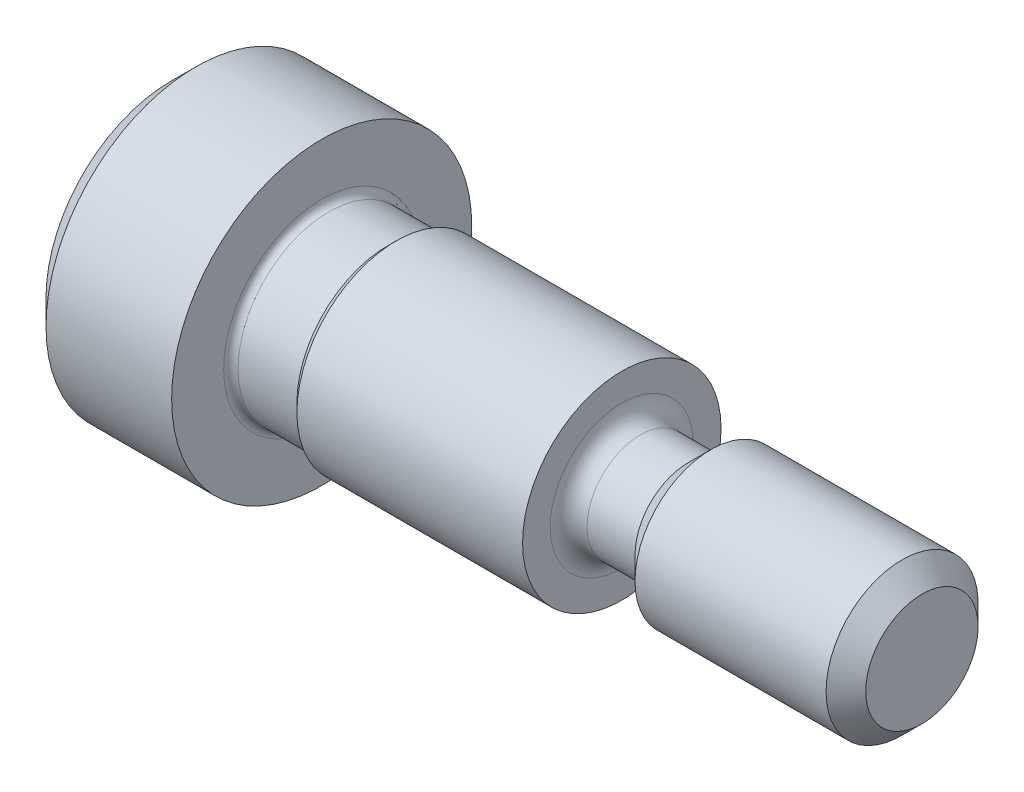
ISO-10303-21;
HEADER;
FILE_DESCRIPTION(('STEP AP214'),'2;1');
FILE_NAME('part.step','',(''),(''),'','','');
FILE_SCHEMA(('AUTOMOTIVE_DESIGN { 1 0 10303 214 1 1 1 1 }'));
ENDSEC;
DATA;
#1=APPLICATION_CONTEXT('core data for automotive mechanical design processes');
#2=APPLICATION_PROTOCOL_DEFINITION('international standard','automotive_design',2000,#1);
#3=PRODUCT_CONTEXT('',#1,'mechanical');
#4=PRODUCT('Part','Part','',(#3));
#5=PRODUCT_RELATED_PRODUCT_CATEGORY('part','',(#4));
#6=PRODUCT_DEFINITION_FORMATION('','',#4);
#7=PRODUCT_DEFINITION_CONTEXT('part definition',#1,'design');
#8=PRODUCT_DEFINITION('design','',#6,#7);
#9=PRODUCT_DEFINITION_SHAPE('','',#8);
#10=(LENGTH_UNIT() NAMED_UNIT(*) SI_UNIT(.MILLI.,.METRE.));
#11=(NAMED_UNIT(*) PLANE_ANGLE_UNIT() SI_UNIT($,.RADIAN.));
#12=(NAMED_UNIT(*) SI_UNIT($,.STERADIAN.) SOLID_ANGLE_UNIT());
#13=UNCERTAINTY_MEASURE_WITH_UNIT(LENGTH_MEASURE(1.E-05),#10,'distance_accuracy_value','');
#14=(GEOMETRIC_REPRESENTATION_CONTEXT(3) GLOBAL_UNCERTAINTY_ASSIGNED_CONTEXT((#13)) GLOBAL_UNIT_ASSIGNED_CONTEXT((#10,
#11,#12)) REPRESENTATION_CONTEXT('',''));
#15=CARTESIAN_POINT('',(0.,0.,0.));
#16=DIRECTION('',(0.,0.,1.));
#17=DIRECTION('',(1.,0.,0.));
#18=AXIS2_PLACEMENT_3D('',#15,#16,#17);
#19=CARTESIAN_POINT('',(0.,0.,0.));
#20=DIRECTION('',(-1.,0.,0.));
#21=DIRECTION('',(0.,0.,1.));
#22=AXIS2_PLACEMENT_3D('',#19,#20,#21);
#23=PLANE('',#22);
#24=CARTESIAN_POINT('',(0.,0.,0.));
#25=DIRECTION('',(-1.,0.,0.));
#26=DIRECTION('',(0.,0.,1.));
#27=AXIS2_PLACEMENT_3D('',#24,#25,#26);
#28=CIRCLE('',#27,3.9751);
#29=CARTESIAN_POINT('',(0.,0.,3.9751));
#30=VERTEX_POINT('',#29);
#31=EDGE_CURVE('E11',#30,#30,#28,.T.);
#32=ORIENTED_EDGE('',*,*,#31,.T.);
#33=EDGE_LOOP('',(#32));
#34=FACE_BOUND('',#33,.T.);
#35=DIRECTION('',(0.,-0.500000000000001,-0.866025403784438));
#36=VECTOR('',#35,1.);
#37=CARTESIAN_POINT('',(0.,-0.916543552338529,1.5875));
#38=LINE('',#37,#36);
#39=CARTESIAN_POINT('',(0.,-0.916543552338529,1.5875));
#40=VERTEX_POINT('',#39);
#41=CARTESIAN_POINT('',(0.,-1.83308710467706,0.));
#42=VERTEX_POINT('',#41);
#43=EDGE_CURVE('E51',#40,#42,#38,.T.);
#44=ORIENTED_EDGE('',*,*,#43,.T.);
#45=DIRECTION('',(0.,0.500000000000001,-0.866025403784438));
#46=VECTOR('',#45,1.);
#47=CARTESIAN_POINT('',(0.,-1.83308710467706,0.));
#48=LINE('',#47,#46);
#49=CARTESIAN_POINT('',(0.,-0.916543552338529,-1.5875));
#50=VERTEX_POINT('',#49);
#51=EDGE_CURVE('E528',#42,#50,#48,.T.);
#52=ORIENTED_EDGE('',*,*,#51,.T.);
#53=DIRECTION('',(0.,1.,0.));
#54=VECTOR('',#53,1.);
#55=CARTESIAN_POINT('',(0.,-0.916543552338529,-1.5875));
#56=LINE('',#55,#54);
#57=CARTESIAN_POINT('',(0.,0.916543552338529,-1.5875));
#58=VERTEX_POINT('',#57);
#59=EDGE_CURVE('E131',#50,#58,#56,.T.);
#60=ORIENTED_EDGE('',*,*,#59,.T.);
#61=DIRECTION('',(0.,0.500000000000001,0.866025403784438));
#62=VECTOR('',#61,1.);
#63=CARTESIAN_POINT('',(0.,0.916543552338529,-1.5875));
#64=LINE('',#63,#62);
#65=CARTESIAN_POINT('',(0.,1.83308710467706,0.));
#66=VERTEX_POINT('',#65);
#67=EDGE_CURVE('E531',#58,#66,#64,.T.);
#68=ORIENTED_EDGE('',*,*,#67,.T.);
#69=DIRECTION('',(0.,-0.500000000000001,0.866025403784438));
#70=VECTOR('',#69,1.);
#71=CARTESIAN_POINT('',(0.,1.83308710467706,0.));
#72=LINE('',#71,#70);
#73=CARTESIAN_POINT('',(0.,0.916543552338529,1.5875));
#74=VERTEX_POINT('',#73);
#75=EDGE_CURVE('E533',#66,#74,#72,.T.);
#76=ORIENTED_EDGE('',*,*,#75,.T.);
#77=DIRECTION('',(0.,-1.,0.));
#78=VECTOR('',#77,1.);
#79=CARTESIAN_POINT('',(0.,0.916543552338529,1.5875));
#80=LINE('',#79,#78);
#81=EDGE_CURVE('E535',#74,#40,#80,.T.);
#82=ORIENTED_EDGE('',*,*,#81,.T.);
#83=EDGE_LOOP('',(#44,#52,#60,#68,#76,#82));
#84=FACE_BOUND('',#83,.T.);
#85=ADVANCED_FACE('F36',(#34,#84),#23,.T.);
#86=CARTESIAN_POINT('',(0.,0.,0.));
#87=DIRECTION('',(1.,0.,0.));
#88=DIRECTION('',(0.,0.,-1.));
#89=AXIS2_PLACEMENT_3D('',#86,#87,#88);
#90=CONICAL_SURFACE('',#89,3.9751,0.785398163397449);
#91=CARTESIAN_POINT('',(0.787400000000001,0.,0.));
#92=DIRECTION('',(-1.,0.,0.));
#93=DIRECTION('',(0.,0.,1.));
#94=AXIS2_PLACEMENT_3D('',#91,#92,#93);
#95=CIRCLE('',#94,4.7625);
#96=CARTESIAN_POINT('',(0.787400000000001,0.,4.7625));
#97=VERTEX_POINT('',#96);
#98=EDGE_CURVE('E44',#97,#97,#95,.T.);
#99=ORIENTED_EDGE('',*,*,#98,.T.);
#100=EDGE_LOOP('',(#99));
#101=FACE_BOUND('',#100,.T.);
#102=ORIENTED_EDGE('',*,*,#31,.F.);
#103=EDGE_LOOP('',(#102));
#104=FACE_BOUND('',#103,.T.);
#105=ADVANCED_FACE('F197',(#101,#104),#90,.T.);
#106=CARTESIAN_POINT('',(-6.34999999999999,0.,0.));
#107=DIRECTION('',(-1.,0.,0.));
#108=DIRECTION('',(0.,0.,1.));
#109=AXIS2_PLACEMENT_3D('',#106,#107,#108);
#110=CYLINDRICAL_SURFACE('',#109,4.7625);
#111=CARTESIAN_POINT('',(4.7752,0.,0.));
#112=DIRECTION('',(-1.,0.,0.));
#113=DIRECTION('',(0.,0.,1.));
#114=AXIS2_PLACEMENT_3D('',#111,#112,#113);
#115=CIRCLE('',#114,4.7625);
#116=CARTESIAN_POINT('',(4.7752,0.,4.7625));
#117=VERTEX_POINT('',#116);
#118=EDGE_CURVE('E189',#117,#117,#115,.T.);
#119=ORIENTED_EDGE('',*,*,#118,.T.);
#120=EDGE_LOOP('',(#119));
#121=FACE_BOUND('',#120,.T.);
#122=ORIENTED_EDGE('',*,*,#98,.F.);
#123=EDGE_LOOP('',(#122));
#124=FACE_BOUND('',#123,.T.);
#125=ADVANCED_FACE('F200',(#121,#124),#110,.T.);
#126=CARTESIAN_POINT('',(4.7752,4.7625,0.));
#127=DIRECTION('',(1.,0.,0.));
#128=DIRECTION('',(0.,0.,-1.));
#129=AXIS2_PLACEMENT_3D('',#126,#127,#128);
#130=PLANE('',#129);
#131=CARTESIAN_POINT('',(4.7752,0.,0.));
#132=DIRECTION('',(-1.,0.,0.));
#133=DIRECTION('',(0.,0.,1.));
#134=AXIS2_PLACEMENT_3D('',#131,#132,#133);
#135=CIRCLE('',#134,3.1115);
#136=CARTESIAN_POINT('',(4.7752,0.,3.1115));
#137=VERTEX_POINT('',#136);
#138=EDGE_CURVE('E185',#137,#137,#135,.T.);
#139=ORIENTED_EDGE('',*,*,#138,.T.);
#140=EDGE_LOOP('',(#139));
#141=FACE_BOUND('',#140,.T.);
#142=ORIENTED_EDGE('',*,*,#118,.F.);
#143=EDGE_LOOP('',(#142));
#144=FACE_BOUND('',#143,.T.);
#145=ADVANCED_FACE('F202',(#141,#144),#130,.T.);
#146=CARTESIAN_POINT('',(5.0038,0.,0.));
#147=DIRECTION('',(-1.,0.,0.));
#148=DIRECTION('',(0.,0.,1.));
#149=AXIS2_PLACEMENT_3D('',#146,#147,#148);
#150=TOROIDAL_SURFACE('',#149,3.1115,0.2286);
#151=ORIENTED_EDGE('',*,*,#138,.F.);
#152=EDGE_LOOP('',(#151));
#153=FACE_BOUND('',#152,.T.);
#154=CARTESIAN_POINT('',(5.0038,0.,0.));
#155=DIRECTION('',(-1.,0.,0.));
#156=DIRECTION('',(0.,0.,1.));
#157=AXIS2_PLACEMENT_3D('',#154,#155,#156);
#158=CIRCLE('',#157,2.8829);
#159=CARTESIAN_POINT('',(5.0038,0.,2.8829));
#160=VERTEX_POINT('',#159);
#161=EDGE_CURVE('E181',#160,#160,#158,.T.);
#162=ORIENTED_EDGE('',*,*,#161,.T.);
#163=EDGE_LOOP('',(#162));
#164=FACE_BOUND('',#163,.T.);
#165=ADVANCED_FACE('F209',(#153,#164),#150,.F.);
#166=CARTESIAN_POINT('',(-6.34999999999999,0.,0.));
#167=DIRECTION('',(-1.,0.,0.));
#168=DIRECTION('',(0.,0.,1.));
#169=AXIS2_PLACEMENT_3D('',#166,#167,#168);
#170=CYLINDRICAL_SURFACE('',#169,2.8829);
#171=CARTESIAN_POINT('',(6.8707,0.,0.));
#172=DIRECTION('',(-1.,0.,0.));
#173=DIRECTION('',(0.,0.,1.));
#174=AXIS2_PLACEMENT_3D('',#171,#172,#173);
#175=CIRCLE('',#174,2.8829);
#176=CARTESIAN_POINT('',(6.8707,0.,2.8829));
#177=VERTEX_POINT('',#176);
#178=EDGE_CURVE('E177',#177,#177,#175,.T.);
#179=ORIENTED_EDGE('',*,*,#178,.T.);
#180=EDGE_LOOP('',(#179));
#181=FACE_BOUND('',#180,.T.);
#182=ORIENTED_EDGE('',*,*,#161,.F.);
#183=EDGE_LOOP('',(#182));
#184=FACE_BOUND('',#183,.T.);
#185=ADVANCED_FACE('F227',(#181,#184),#170,.T.);
#186=CARTESIAN_POINT('',(6.8707,0.,0.));
#187=DIRECTION('',(1.,0.,0.));
#188=DIRECTION('',(0.,0.,-1.));
#189=AXIS2_PLACEMENT_3D('',#186,#187,#188);
#190=CONICAL_SURFACE('',#189,2.8829,0.785398163397452);
#191=CARTESIAN_POINT('',(7.1374,0.,0.));
#192=DIRECTION('',(-1.,0.,0.));
#193=DIRECTION('',(0.,0.,1.));
#194=AXIS2_PLACEMENT_3D('',#191,#192,#193);
#195=CIRCLE('',#194,3.1496);
#196=CARTESIAN_POINT('',(7.1374,0.,3.1496));
#197=VERTEX_POINT('',#196);
#198=EDGE_CURVE('E173',#197,#197,#195,.T.);
#199=ORIENTED_EDGE('',*,*,#198,.T.);
#200=EDGE_LOOP('',(#199));
#201=FACE_BOUND('',#200,.T.);
#202=ORIENTED_EDGE('',*,*,#178,.F.);
#203=EDGE_LOOP('',(#202));
#204=FACE_BOUND('',#203,.T.);
#205=ADVANCED_FACE('F231',(#201,#204),#190,.T.);
#206=CARTESIAN_POINT('',(-6.34999999999999,0.,0.));
#207=DIRECTION('',(-1.,0.,0.));
#208=DIRECTION('',(0.,0.,1.));
#209=AXIS2_PLACEMENT_3D('',#206,#207,#208);
#210=CYLINDRICAL_SURFACE('',#209,3.1496);
#211=CARTESIAN_POINT('',(14.3002,0.,0.));
#212=DIRECTION('',(-1.,0.,0.));
#213=DIRECTION('',(0.,0.,1.));
#214=AXIS2_PLACEMENT_3D('',#211,#212,#213);
#215=CIRCLE('',#214,3.1496);
#216=CARTESIAN_POINT('',(14.3002,0.,3.1496));
#217=VERTEX_POINT('',#216);
#218=EDGE_CURVE('E169',#217,#217,#215,.T.);
#219=ORIENTED_EDGE('',*,*,#218,.T.);
#220=EDGE_LOOP('',(#219));
#221=FACE_BOUND('',#220,.T.);
#222=ORIENTED_EDGE('',*,*,#198,.F.);
#223=EDGE_LOOP('',(#222));
#224=FACE_BOUND('',#223,.T.);
#225=ADVANCED_FACE('F247',(#221,#224),#210,.T.);
#226=CARTESIAN_POINT('',(14.3002,3.1496,0.));
#227=DIRECTION('',(1.,0.,0.));
#228=DIRECTION('',(0.,0.,-1.));
#229=AXIS2_PLACEMENT_3D('',#226,#227,#228);
#230=PLANE('',#229);
#231=CARTESIAN_POINT('',(14.3002,0.,0.));
#232=DIRECTION('',(-1.,0.,0.));
#233=DIRECTION('',(0.,0.,1.));
#234=AXIS2_PLACEMENT_3D('',#231,#232,#233);
#235=CIRCLE('',#234,2.2733);
#236=CARTESIAN_POINT('',(14.3002,0.,2.2733));
#237=VERTEX_POINT('',#236);
#238=EDGE_CURVE('E165',#237,#237,#235,.T.);
#239=ORIENTED_EDGE('',*,*,#238,.T.);
#240=EDGE_LOOP('',(#239));
#241=FACE_BOUND('',#240,.T.);
#242=ORIENTED_EDGE('',*,*,#218,.F.);
#243=EDGE_LOOP('',(#242));
#244=FACE_BOUND('',#243,.T.);
#245=ADVANCED_FACE('F256',(#241,#244),#230,.T.);
#246=CARTESIAN_POINT('',(14.8844,0.,0.));
#247=DIRECTION('',(-1.,0.,0.));
#248=DIRECTION('',(0.,0.,1.));
#249=AXIS2_PLACEMENT_3D('',#246,#247,#248);
#250=TOROIDAL_SURFACE('',#249,2.2733,0.5842);
#251=CARTESIAN_POINT('',(14.8844,0.,0.));
#252=DIRECTION('',(-1.,0.,0.));
#253=DIRECTION('',(0.,0.,1.));
#254=AXIS2_PLACEMENT_3D('',#251,#252,#253);
#255=CIRCLE('',#254,1.6891);
#256=CARTESIAN_POINT('',(14.8844,0.,1.6891));
#257=VERTEX_POINT('',#256);
#258=EDGE_CURVE('E161',#257,#257,#255,.T.);
#259=ORIENTED_EDGE('',*,*,#258,.T.);
#260=EDGE_LOOP('',(#259));
#261=FACE_BOUND('',#260,.T.);
#262=ORIENTED_EDGE('',*,*,#238,.F.);
#263=EDGE_LOOP('',(#262));
#264=FACE_BOUND('',#263,.T.);
#265=ADVANCED_FACE('F263',(#261,#264),#250,.F.);
#266=CARTESIAN_POINT('',(-6.34999999999999,0.,0.));
#267=DIRECTION('',(-1.,0.,0.));
#268=DIRECTION('',(0.,0.,1.));
#269=AXIS2_PLACEMENT_3D('',#266,#267,#268);
#270=CYLINDRICAL_SURFACE('',#269,1.6891);
#271=CARTESIAN_POINT('',(16.4084,0.,0.));
#272=DIRECTION('',(-1.,0.,0.));
#273=DIRECTION('',(0.,0.,1.));
#274=AXIS2_PLACEMENT_3D('',#271,#272,#273);
#275=CIRCLE('',#274,1.6891);
#276=CARTESIAN_POINT('',(16.4084,0.,1.6891));
#277=VERTEX_POINT('',#276);
#278=EDGE_CURVE('E157',#277,#277,#275,.T.);
#279=ORIENTED_EDGE('',*,*,#278,.T.);
#280=EDGE_LOOP('',(#279));
#281=FACE_BOUND('',#280,.T.);
#282=ORIENTED_EDGE('',*,*,#258,.F.);
#283=EDGE_LOOP('',(#282));
#284=FACE_BOUND('',#283,.T.);
#285=ADVANCED_FACE('F271',(#281,#284),#270,.T.);
#286=CARTESIAN_POINT('',(16.4084,0.,0.));
#287=DIRECTION('',(1.,0.,0.));
#288=DIRECTION('',(0.,0.,-1.));
#289=AXIS2_PLACEMENT_3D('',#286,#287,#288);
#290=CONICAL_SURFACE('',#289,1.6891,0.785398163397449);
#291=CARTESIAN_POINT('',(17.1323,0.,0.));
#292=DIRECTION('',(-1.,0.,0.));
#293=DIRECTION('',(0.,0.,1.));
#294=AXIS2_PLACEMENT_3D('',#291,#292,#293);
#295=CIRCLE('',#294,2.413);
#296=CARTESIAN_POINT('',(17.1323,0.,2.413));
#297=VERTEX_POINT('',#296);
#298=EDGE_CURVE('E153',#297,#297,#295,.T.);
#299=ORIENTED_EDGE('',*,*,#298,.T.);
#300=EDGE_LOOP('',(#299));
#301=FACE_BOUND('',#300,.T.);
#302=ORIENTED_EDGE('',*,*,#278,.F.);
#303=EDGE_LOOP('',(#302));
#304=FACE_BOUND('',#303,.T.);
#305=ADVANCED_FACE('F279',(#301,#304),#290,.T.);
#306=CARTESIAN_POINT('',(-6.34999999999999,0.,0.));
#307=DIRECTION('',(-1.,0.,0.));
#308=DIRECTION('',(0.,0.,1.));
#309=AXIS2_PLACEMENT_3D('',#306,#307,#308);
#310=CYLINDRICAL_SURFACE('',#309,2.413);
#311=CARTESIAN_POINT('',(23.19528,0.,0.));
#312=DIRECTION('',(-1.,0.,0.));
#313=DIRECTION('',(0.,0.,1.));
#314=AXIS2_PLACEMENT_3D('',#311,#312,#313);
#315=CIRCLE('',#314,2.413);
#316=CARTESIAN_POINT('',(23.19528,0.,2.413));
#317=VERTEX_POINT('',#316);
#318=EDGE_CURVE('E149',#317,#317,#315,.T.);
#319=ORIENTED_EDGE('',*,*,#318,.T.);
#320=EDGE_LOOP('',(#319));
#321=FACE_BOUND('',#320,.T.);
#322=ORIENTED_EDGE('',*,*,#298,.F.);
#323=EDGE_LOOP('',(#322));
#324=FACE_BOUND('',#323,.T.);
#325=ADVANCED_FACE('F287',(#321,#324),#310,.T.);
#326=CARTESIAN_POINT('',(23.19528,0.,0.));
#327=DIRECTION('',(-1.,0.,0.));
#328=DIRECTION('',(0.,0.,1.));
#329=AXIS2_PLACEMENT_3D('',#326,#327,#328);
#330=CONICAL_SURFACE('',#329,2.413,0.785398163397444);
#331=CARTESIAN_POINT('',(23.8252,0.,0.));
#332=DIRECTION('',(-1.,0.,0.));
#333=DIRECTION('',(0.,0.,1.));
#334=AXIS2_PLACEMENT_3D('',#331,#332,#333);
#335=CIRCLE('',#334,1.78308);
#336=CARTESIAN_POINT('',(23.8252,0.,1.78308));
#337=VERTEX_POINT('',#336);
#338=EDGE_CURVE('E144',#337,#337,#335,.T.);
#339=ORIENTED_EDGE('',*,*,#338,.T.);
#340=EDGE_LOOP('',(#339));
#341=FACE_BOUND('',#340,.T.);
#342=ORIENTED_EDGE('',*,*,#318,.F.);
#343=EDGE_LOOP('',(#342));
#344=FACE_BOUND('',#343,.T.);
#345=ADVANCED_FACE('F296',(#341,#344),#330,.T.);
#346=CARTESIAN_POINT('',(23.8252,1.78308,0.));
#347=DIRECTION('',(1.,0.,0.));
#348=DIRECTION('',(0.,0.,-1.));
#349=AXIS2_PLACEMENT_3D('',#346,#347,#348);
#350=PLANE('',#349);
#351=ORIENTED_EDGE('',*,*,#338,.F.);
#352=EDGE_LOOP('',(#351));
#353=FACE_BOUND('',#352,.T.);
#354=ADVANCED_FACE('F303',(#353),#350,.T.);
#355=CARTESIAN_POINT('',(2.3876,-1.83308710467706,0.));
#356=DIRECTION('',(0.,0.866025403784438,0.500000000000001));
#357=DIRECTION('',(0.,-0.500000000000001,0.866025403784438));
#358=AXIS2_PLACEMENT_3D('',#355,#356,#357);
#359=PLANE('',#358);
#360=DIRECTION('',(0.,0.500000000000001,-0.866025403784438));
#361=VECTOR('',#360,1.);
#362=CARTESIAN_POINT('',(2.3876,-1.83308710467706,0.));
#363=LINE('',#362,#361);
#364=CARTESIAN_POINT('',(2.3876,-1.83308710467706,0.));
#365=VERTEX_POINT('',#364);
#366=CARTESIAN_POINT('',(2.3876,-1.37481532850779,-0.793750000000001));
#367=VERTEX_POINT('',#366);
#368=EDGE_CURVE('E59',#365,#367,#363,.T.);
#369=ORIENTED_EDGE('',*,*,#368,.T.);
#370=CARTESIAN_POINT('',(2.3876,-0.916543552338529,-1.5875));
#371=VERTEX_POINT('',#370);
#372=EDGE_CURVE('E109',#367,#371,#363,.T.);
#373=ORIENTED_EDGE('',*,*,#372,.T.);
#374=DIRECTION('',(-1.,0.,0.));
#375=VECTOR('',#374,1.);
#376=CARTESIAN_POINT('',(2.3876,-0.916543552338529,-1.5875));
#377=LINE('',#376,#375);
#378=EDGE_CURVE('E113',#371,#50,#377,.T.);
#379=ORIENTED_EDGE('',*,*,#378,.T.);
#380=ORIENTED_EDGE('',*,*,#51,.F.);
#381=DIRECTION('',(-1.,0.,0.));
#382=VECTOR('',#381,1.);
#383=CARTESIAN_POINT('',(2.3876,-1.83308710467706,0.));
#384=LINE('',#383,#382);
#385=EDGE_CURVE('E527',#365,#42,#384,.T.);
#386=ORIENTED_EDGE('',*,*,#385,.F.);
#387=EDGE_LOOP('',(#369,#373,#379,#380,#386));
#388=FACE_BOUND('',#387,.T.);
#389=ADVANCED_FACE('F111',(#388),#359,.T.);
#390=CARTESIAN_POINT('',(2.3876,-0.916543552338529,-1.5875));
#391=DIRECTION('',(0.,0.,1.));
#392=DIRECTION('',(0.,-1.,0.));
#393=AXIS2_PLACEMENT_3D('',#390,#391,#392);
#394=PLANE('',#393);
#395=DIRECTION('',(0.,1.,0.));
#396=VECTOR('',#395,1.);
#397=CARTESIAN_POINT('',(2.3876,-0.916543552338529,-1.5875));
#398=LINE('',#397,#396);
#399=CARTESIAN_POINT('',(2.3876,0.,-1.5875));
#400=VERTEX_POINT('',#399);
#401=EDGE_CURVE('E118',#371,#400,#398,.T.);
#402=ORIENTED_EDGE('',*,*,#401,.T.);
#403=CARTESIAN_POINT('',(2.3876,0.916543552338529,-1.5875));
#404=VERTEX_POINT('',#403);
#405=EDGE_CURVE('E126',#400,#404,#398,.T.);
#406=ORIENTED_EDGE('',*,*,#405,.T.);
#407=DIRECTION('',(-1.,0.,0.));
#408=VECTOR('',#407,1.);
#409=CARTESIAN_POINT('',(2.3876,0.916543552338529,-1.5875));
#410=LINE('',#409,#408);
#411=EDGE_CURVE('E133',#404,#58,#410,.T.);
#412=ORIENTED_EDGE('',*,*,#411,.T.);
#413=ORIENTED_EDGE('',*,*,#59,.F.);
#414=ORIENTED_EDGE('',*,*,#378,.F.);
#415=EDGE_LOOP('',(#402,#406,#412,#413,#414));
#416=FACE_BOUND('',#415,.T.);
#417=ADVANCED_FACE('F129',(#416),#394,.T.);
#418=CARTESIAN_POINT('',(2.3876,0.916543552338529,-1.5875));
#419=DIRECTION('',(0.,-0.866025403784438,0.500000000000001));
#420=DIRECTION('',(0.,-0.500000000000001,-0.866025403784438));
#421=AXIS2_PLACEMENT_3D('',#418,#419,#420);
#422=PLANE('',#421);
#423=DIRECTION('',(0.,0.500000000000001,0.866025403784438));
#424=VECTOR('',#423,1.);
#425=CARTESIAN_POINT('',(2.3876,0.916543552338529,-1.5875));
#426=LINE('',#425,#424);
#427=CARTESIAN_POINT('',(2.3876,1.37481532850779,-0.793750000000001));
#428=VERTEX_POINT('',#427);
#429=EDGE_CURVE('E551',#404,#428,#426,.T.);
#430=ORIENTED_EDGE('',*,*,#429,.T.);
#431=CARTESIAN_POINT('',(2.3876,1.83308710467706,0.));
#432=VERTEX_POINT('',#431);
#433=EDGE_CURVE('E125',#428,#432,#426,.T.);
#434=ORIENTED_EDGE('',*,*,#433,.T.);
#435=DIRECTION('',(-1.,0.,0.));
#436=VECTOR('',#435,1.);
#437=CARTESIAN_POINT('',(2.3876,1.83308710467706,0.));
#438=LINE('',#437,#436);
#439=EDGE_CURVE('E139',#432,#66,#438,.T.);
#440=ORIENTED_EDGE('',*,*,#439,.T.);
#441=ORIENTED_EDGE('',*,*,#67,.F.);
#442=ORIENTED_EDGE('',*,*,#411,.F.);
#443=EDGE_LOOP('',(#430,#434,#440,#441,#442));
#444=FACE_BOUND('',#443,.T.);
#445=ADVANCED_FACE('F324',(#444),#422,.T.);
#446=CARTESIAN_POINT('',(2.3876,1.83308710467706,0.));
#447=DIRECTION('',(0.,-0.866025403784438,-0.500000000000001));
#448=DIRECTION('',(0.,0.500000000000001,-0.866025403784438));
#449=AXIS2_PLACEMENT_3D('',#446,#447,#448);
#450=PLANE('',#449);
#451=DIRECTION('',(0.,-0.500000000000001,0.866025403784438));
#452=VECTOR('',#451,1.);
#453=CARTESIAN_POINT('',(2.3876,1.83308710467706,0.));
#454=LINE('',#453,#452);
#455=CARTESIAN_POINT('',(2.3876,1.37481532850779,0.793750000000001));
#456=VERTEX_POINT('',#455);
#457=EDGE_CURVE('E516',#432,#456,#454,.T.);
#458=ORIENTED_EDGE('',*,*,#457,.T.);
#459=CARTESIAN_POINT('',(2.3876,0.916543552338529,1.5875));
#460=VERTEX_POINT('',#459);
#461=EDGE_CURVE('E507',#456,#460,#454,.T.);
#462=ORIENTED_EDGE('',*,*,#461,.T.);
#463=DIRECTION('',(-1.,0.,0.));
#464=VECTOR('',#463,1.);
#465=CARTESIAN_POINT('',(2.3876,0.916543552338529,1.5875));
#466=LINE('',#465,#464);
#467=EDGE_CURVE('E521',#460,#74,#466,.T.);
#468=ORIENTED_EDGE('',*,*,#467,.T.);
#469=ORIENTED_EDGE('',*,*,#75,.F.);
#470=ORIENTED_EDGE('',*,*,#439,.F.);
#471=EDGE_LOOP('',(#458,#462,#468,#469,#470));
#472=FACE_BOUND('',#471,.T.);
#473=ADVANCED_FACE('F331',(#472),#450,.T.);
#474=CARTESIAN_POINT('',(2.3876,0.916543552338529,1.5875));
#475=DIRECTION('',(0.,0.,-1.));
#476=DIRECTION('',(-1.,0.,0.));
#477=AXIS2_PLACEMENT_3D('',#474,#475,#476);
#478=PLANE('',#477);
#479=DIRECTION('',(0.,-1.,0.));
#480=VECTOR('',#479,1.);
#481=CARTESIAN_POINT('',(2.3876,0.916543552338529,1.5875));
#482=LINE('',#481,#480);
#483=CARTESIAN_POINT('',(2.3876,0.,1.5875));
#484=VERTEX_POINT('',#483);
#485=EDGE_CURVE('E506',#460,#484,#482,.T.);
#486=ORIENTED_EDGE('',*,*,#485,.T.);
#487=CARTESIAN_POINT('',(2.3876,-0.916543552338529,1.5875));
#488=VERTEX_POINT('',#487);
#489=EDGE_CURVE('E510',#484,#488,#482,.T.);
#490=ORIENTED_EDGE('',*,*,#489,.T.);
#491=DIRECTION('',(-1.,0.,0.));
#492=VECTOR('',#491,1.);
#493=CARTESIAN_POINT('',(2.3876,-0.916543552338529,1.5875));
#494=LINE('',#493,#492);
#495=EDGE_CURVE('E540',#488,#40,#494,.T.);
#496=ORIENTED_EDGE('',*,*,#495,.T.);
#497=ORIENTED_EDGE('',*,*,#81,.F.);
#498=ORIENTED_EDGE('',*,*,#467,.F.);
#499=EDGE_LOOP('',(#486,#490,#496,#497,#498));
#500=FACE_BOUND('',#499,.T.);
#501=ADVANCED_FACE('F339',(#500),#478,.T.);
#502=CARTESIAN_POINT('',(2.3876,-0.916543552338529,1.5875));
#503=DIRECTION('',(0.,0.866025403784438,-0.500000000000001));
#504=DIRECTION('',(0.,0.500000000000001,0.866025403784438));
#505=AXIS2_PLACEMENT_3D('',#502,#503,#504);
#506=PLANE('',#505);
#507=DIRECTION('',(0.,-0.500000000000001,-0.866025403784438));
#508=VECTOR('',#507,1.);
#509=CARTESIAN_POINT('',(2.3876,-0.916543552338529,1.5875));
#510=LINE('',#509,#508);
#511=CARTESIAN_POINT('',(2.3876,-1.3748153285078,0.793750000000002));
#512=VERTEX_POINT('',#511);
#513=EDGE_CURVE('E513',#488,#512,#510,.T.);
#514=ORIENTED_EDGE('',*,*,#513,.T.);
#515=EDGE_CURVE('E522',#512,#365,#510,.T.);
#516=ORIENTED_EDGE('',*,*,#515,.T.);
#517=ORIENTED_EDGE('',*,*,#385,.T.);
#518=ORIENTED_EDGE('',*,*,#43,.F.);
#519=ORIENTED_EDGE('',*,*,#495,.F.);
#520=EDGE_LOOP('',(#514,#516,#517,#518,#519));
#521=FACE_BOUND('',#520,.T.);
#522=ADVANCED_FACE('F347',(#521),#506,.T.);
#523=CARTESIAN_POINT('',(2.3876,0.,-3.17499999999999));
#524=DIRECTION('',(1.,0.,0.));
#525=DIRECTION('',(0.,0.,-1.));
#526=AXIS2_PLACEMENT_3D('',#523,#524,#525);
#527=PLANE('',#526);
#528=CARTESIAN_POINT('',(2.3876,0.,0.));
#529=DIRECTION('',(-1.,0.,0.));
#530=DIRECTION('',(0.,0.,1.));
#531=AXIS2_PLACEMENT_3D('',#528,#529,#530);
#532=CIRCLE('',#531,1.5875);
#533=EDGE_CURVE('E552',#428,#400,#532,.T.);
#534=ORIENTED_EDGE('',*,*,#533,.F.);
#535=ORIENTED_EDGE('',*,*,#429,.F.);
#536=ORIENTED_EDGE('',*,*,#405,.F.);
#537=EDGE_LOOP('',(#534,#535,#536));
#538=FACE_BOUND('',#537,.T.);
#539=ADVANCED_FACE('F355',(#538),#527,.F.);
#540=EDGE_CURVE('E145',#456,#428,#532,.T.);
#541=ORIENTED_EDGE('',*,*,#540,.F.);
#542=ORIENTED_EDGE('',*,*,#457,.F.);
#543=ORIENTED_EDGE('',*,*,#433,.F.);
#544=EDGE_LOOP('',(#541,#542,#543));
#545=FACE_BOUND('',#544,.T.);
#546=ADVANCED_FACE('F363',(#545),#527,.F.);
#547=EDGE_CURVE('E138',#484,#456,#532,.T.);
#548=ORIENTED_EDGE('',*,*,#547,.F.);
#549=ORIENTED_EDGE('',*,*,#485,.F.);
#550=ORIENTED_EDGE('',*,*,#461,.F.);
#551=EDGE_LOOP('',(#548,#549,#550));
#552=FACE_BOUND('',#551,.T.);
#553=ADVANCED_FACE('F371',(#552),#527,.F.);
#554=EDGE_CURVE('E132',#512,#484,#532,.T.);
#555=ORIENTED_EDGE('',*,*,#554,.F.);
#556=ORIENTED_EDGE('',*,*,#513,.F.);
#557=ORIENTED_EDGE('',*,*,#489,.F.);
#558=EDGE_LOOP('',(#555,#556,#557));
#559=FACE_BOUND('',#558,.T.);
#560=ADVANCED_FACE('F378',(#559),#527,.F.);
#561=EDGE_CURVE('E136',#367,#512,#532,.T.);
#562=ORIENTED_EDGE('',*,*,#561,.F.);
#563=ORIENTED_EDGE('',*,*,#368,.F.);
#564=ORIENTED_EDGE('',*,*,#515,.F.);
#565=EDGE_LOOP('',(#562,#563,#564));
#566=FACE_BOUND('',#565,.T.);
#567=ADVANCED_FACE('F385',(#566),#527,.F.);
#568=EDGE_CURVE('E121',#400,#367,#532,.T.);
#569=ORIENTED_EDGE('',*,*,#568,.F.);
#570=ORIENTED_EDGE('',*,*,#401,.F.);
#571=ORIENTED_EDGE('',*,*,#372,.F.);
#572=EDGE_LOOP('',(#569,#570,#571));
#573=FACE_BOUND('',#572,.T.);
#574=ADVANCED_FACE('F119',(#573),#527,.F.);
#575=CARTESIAN_POINT('',(3.30414355233854,0.,0.));
#576=DIRECTION('',(-1.,0.,0.));
#577=DIRECTION('',(0.,0.,1.));
#578=AXIS2_PLACEMENT_3D('',#575,#576,#577);
#579=CONICAL_SURFACE('',#578,0.,1.04719755119659);
#580=ORIENTED_EDGE('',*,*,#547,.T.);
#581=ORIENTED_EDGE('',*,*,#540,.T.);
#582=ORIENTED_EDGE('',*,*,#533,.T.);
#583=ORIENTED_EDGE('',*,*,#568,.T.);
#584=ORIENTED_EDGE('',*,*,#561,.T.);
#585=ORIENTED_EDGE('',*,*,#554,.T.);
#586=EDGE_LOOP('',(#580,#581,#582,#583,#584,#585));
#587=FACE_BOUND('',#586,.T.);
#588=CARTESIAN_POINT('',(3.30414355233854,0.,0.));
#589=VERTEX_POINT('',#588);
#590=VERTEX_LOOP('',#589);
#591=FACE_BOUND('',#590,.T.);
#592=ADVANCED_FACE('F398',(#587,#591),#579,.F.);
#593=CLOSED_SHELL('',(#85,#105,#125,#145,#165,#185,#205,#225,#245,#265,#285,#305,#325,#345,#354,
#389,#417,#445,#473,#501,#522,#539,#546,#553,#560,#567,#574,#592));
#594=MANIFOLD_SOLID_BREP('B2',#593);
#595=ADVANCED_BREP_SHAPE_REPRESENTATION('',(#18,#594),#14);
#596=SHAPE_DEFINITION_REPRESENTATION(#9,#595);
ENDSEC;
END-ISO-10303-21;
